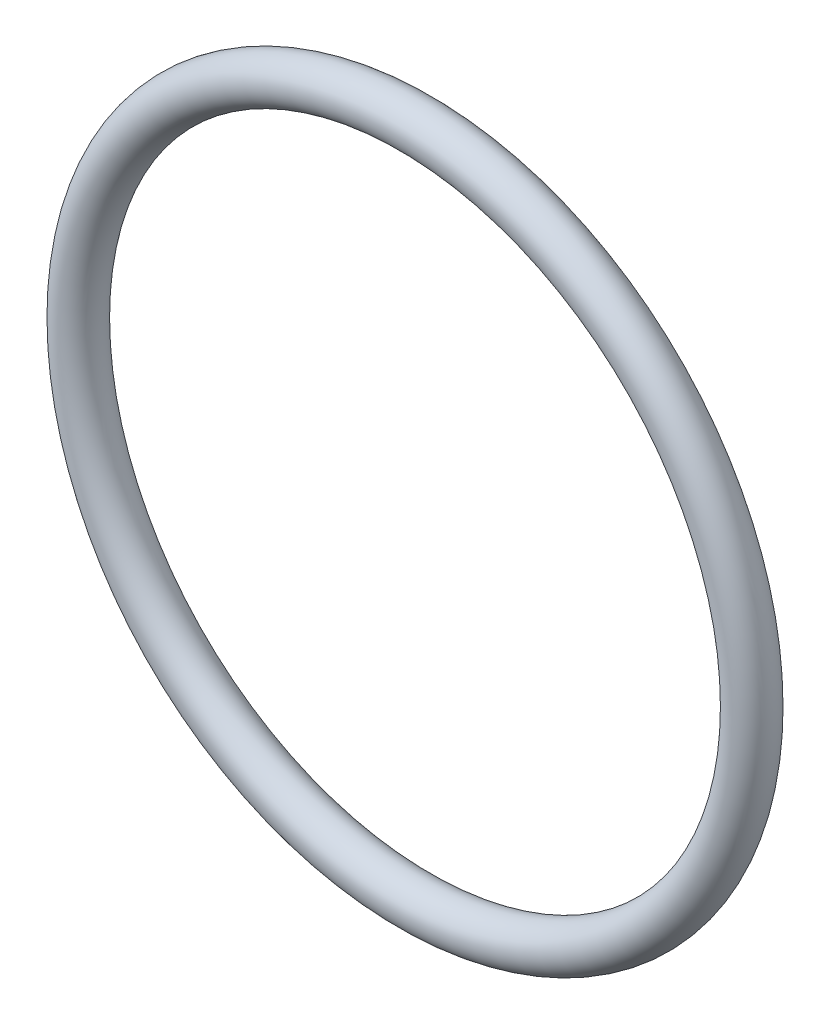
ISO-10303-21;
HEADER;
FILE_DESCRIPTION(('STEP AP214'),'2;1');
FILE_NAME('part.step','',(''),(''),'','','');
FILE_SCHEMA(('AUTOMOTIVE_DESIGN { 1 0 10303 214 1 1 1 1 }'));
ENDSEC;
DATA;
#1=APPLICATION_CONTEXT('core data for automotive mechanical design processes');
#2=APPLICATION_PROTOCOL_DEFINITION('international standard','automotive_design',2000,#1);
#3=PRODUCT_CONTEXT('',#1,'mechanical');
#4=PRODUCT('Part','Part','',(#3));
#5=PRODUCT_RELATED_PRODUCT_CATEGORY('part','',(#4));
#6=PRODUCT_DEFINITION_FORMATION('','',#4);
#7=PRODUCT_DEFINITION_CONTEXT('part definition',#1,'design');
#8=PRODUCT_DEFINITION('design','',#6,#7);
#9=PRODUCT_DEFINITION_SHAPE('','',#8);
#10=(LENGTH_UNIT() NAMED_UNIT(*) SI_UNIT(.MILLI.,.METRE.));
#11=(NAMED_UNIT(*) PLANE_ANGLE_UNIT() SI_UNIT($,.RADIAN.));
#12=(NAMED_UNIT(*) SI_UNIT($,.STERADIAN.) SOLID_ANGLE_UNIT());
#13=UNCERTAINTY_MEASURE_WITH_UNIT(LENGTH_MEASURE(1.E-05),#10,'distance_accuracy_value','');
#14=(GEOMETRIC_REPRESENTATION_CONTEXT(3) GLOBAL_UNCERTAINTY_ASSIGNED_CONTEXT((#13)) GLOBAL_UNIT_ASSIGNED_CONTEXT((#10,
#11,#12)) REPRESENTATION_CONTEXT('',''));
#15=CARTESIAN_POINT('',(0.,0.,0.));
#16=DIRECTION('',(0.,0.,1.));
#17=DIRECTION('',(1.,0.,0.));
#18=AXIS2_PLACEMENT_3D('',#15,#16,#17);
#19=CARTESIAN_POINT('',(0.,0.,0.));
#20=DIRECTION('',(0.,0.,1.));
#21=DIRECTION('',(1.,0.,0.));
#22=AXIS2_PLACEMENT_3D('',#19,#20,#21);
#23=TOROIDAL_SURFACE('',#22,24.13,1.5875);
#24=CARTESIAN_POINT('',(25.7175,0.,0.));
#25=VERTEX_POINT('',#24);
#26=VERTEX_LOOP('',#25);
#27=FACE_BOUND('',#26,.T.);
#28=ADVANCED_FACE('F35',(#27),#23,.T.);
#29=CLOSED_SHELL('',(#28));
#30=MANIFOLD_SOLID_BREP('B2',#29);
#31=ADVANCED_BREP_SHAPE_REPRESENTATION('',(#18,#30),#14);
#32=SHAPE_DEFINITION_REPRESENTATION(#9,#31);
ENDSEC;
END-ISO-10303-21;
